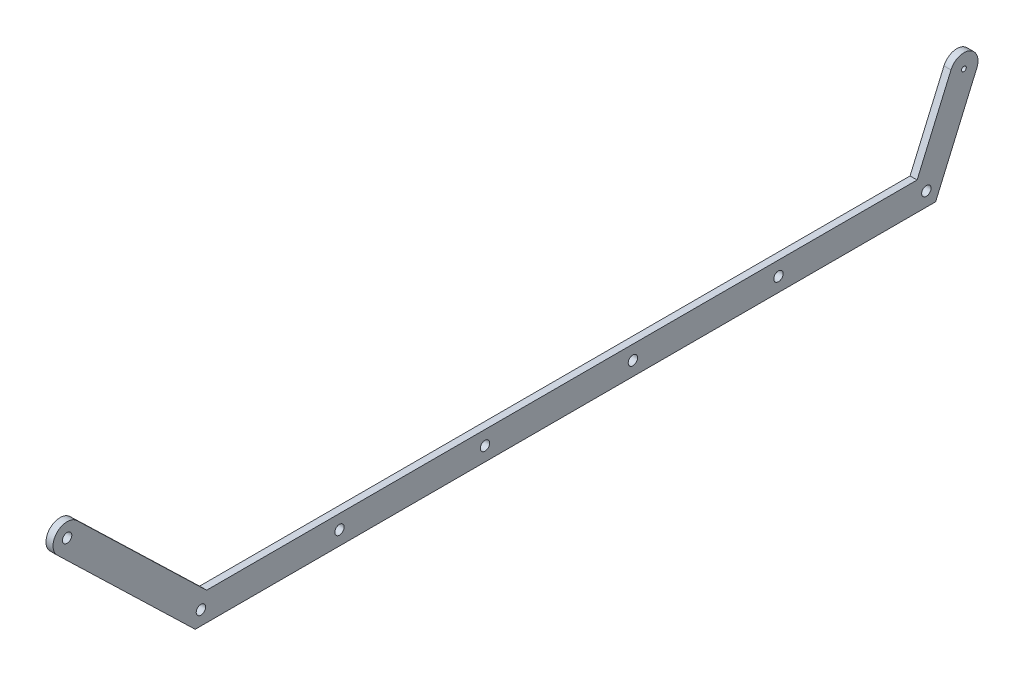
ISO-10303-21;
HEADER;
FILE_DESCRIPTION(('STEP AP214'),'2;1');
FILE_NAME('part.step','',(''),(''),'','','');
FILE_SCHEMA(('AUTOMOTIVE_DESIGN { 1 0 10303 214 1 1 1 1 }'));
ENDSEC;
DATA;
#1=APPLICATION_CONTEXT('core data for automotive mechanical design processes');
#2=APPLICATION_PROTOCOL_DEFINITION('international standard','automotive_design',2000,#1);
#3=PRODUCT_CONTEXT('',#1,'mechanical');
#4=PRODUCT('Part','Part','',(#3));
#5=PRODUCT_RELATED_PRODUCT_CATEGORY('part','',(#4));
#6=PRODUCT_DEFINITION_FORMATION('','',#4);
#7=PRODUCT_DEFINITION_CONTEXT('part definition',#1,'design');
#8=PRODUCT_DEFINITION('design','',#6,#7);
#9=PRODUCT_DEFINITION_SHAPE('','',#8);
#10=(LENGTH_UNIT() NAMED_UNIT(*) SI_UNIT(.MILLI.,.METRE.));
#11=(NAMED_UNIT(*) PLANE_ANGLE_UNIT() SI_UNIT($,.RADIAN.));
#12=(NAMED_UNIT(*) SI_UNIT($,.STERADIAN.) SOLID_ANGLE_UNIT());
#13=UNCERTAINTY_MEASURE_WITH_UNIT(LENGTH_MEASURE(1.E-05),#10,'distance_accuracy_value','');
#14=(GEOMETRIC_REPRESENTATION_CONTEXT(3) GLOBAL_UNCERTAINTY_ASSIGNED_CONTEXT((#13)) GLOBAL_UNIT_ASSIGNED_CONTEXT((#10,
#11,#12)) REPRESENTATION_CONTEXT('',''));
#15=CARTESIAN_POINT('',(0.,0.,0.));
#16=DIRECTION('',(0.,0.,1.));
#17=DIRECTION('',(1.,0.,0.));
#18=AXIS2_PLACEMENT_3D('',#15,#16,#17);
#19=CARTESIAN_POINT('',(3.,-18.,-382.));
#20=DIRECTION('',(-1.,0.,0.));
#21=DIRECTION('',(0.,0.,1.));
#22=AXIS2_PLACEMENT_3D('',#19,#20,#21);
#23=CYLINDRICAL_SURFACE('',#22,6.00000000000002);
#24=CARTESIAN_POINT('',(0.,-18.,-382.));
#25=DIRECTION('',(1.,0.,0.));
#26=DIRECTION('',(0.,0.,-1.));
#27=AXIS2_PLACEMENT_3D('',#24,#25,#26);
#28=CIRCLE('',#27,6.00000000000002);
#29=CARTESIAN_POINT('',(0.,-15.6185330958872,-376.492857784239));
#30=VERTEX_POINT('',#29);
#31=CARTESIAN_POINT('',(0.,-20.3814669041128,-387.507142215761));
#32=VERTEX_POINT('',#31);
#33=EDGE_CURVE('E150',#30,#32,#28,.F.);
#34=ORIENTED_EDGE('',*,*,#33,.F.);
#35=DIRECTION('',(-1.,0.,0.));
#36=VECTOR('',#35,1.);
#37=CARTESIAN_POINT('',(3.,-15.6185330958872,-376.492857784239));
#38=LINE('',#37,#36);
#39=CARTESIAN_POINT('',(3.,-15.6185330958872,-376.492857784239));
#40=VERTEX_POINT('',#39);
#41=EDGE_CURVE('E11',#40,#30,#38,.T.);
#42=ORIENTED_EDGE('',*,*,#41,.F.);
#43=CARTESIAN_POINT('',(3.,-18.,-382.));
#44=DIRECTION('',(1.,0.,0.));
#45=DIRECTION('',(0.,0.,-1.));
#46=AXIS2_PLACEMENT_3D('',#43,#44,#45);
#47=CIRCLE('',#46,6.00000000000002);
#48=CARTESIAN_POINT('',(3.,-20.3814669041128,-387.507142215761));
#49=VERTEX_POINT('',#48);
#50=EDGE_CURVE('E191',#40,#49,#47,.F.);
#51=ORIENTED_EDGE('',*,*,#50,.T.);
#52=DIRECTION('',(-1.,0.,0.));
#53=VECTOR('',#52,1.);
#54=CARTESIAN_POINT('',(3.,-20.3814669041128,-387.507142215761));
#55=LINE('',#54,#53);
#56=EDGE_CURVE('E84',#49,#32,#55,.T.);
#57=ORIENTED_EDGE('',*,*,#56,.T.);
#58=EDGE_LOOP('',(#34,#42,#51,#57));
#59=FACE_BOUND('',#58,.T.);
#60=ADVANCED_FACE('F33',(#59),#23,.T.);
#61=CARTESIAN_POINT('',(3.,-139.619763865118,-322.870703938085));
#62=DIRECTION('',(0.,-0.396911150685467,-0.917857035960143));
#63=DIRECTION('',(0.,0.917857035960143,-0.396911150685467));
#64=AXIS2_PLACEMENT_3D('',#61,#62,#63);
#65=PLANE('',#64);
#66=DIRECTION('',(0.,-0.917857035960143,0.396911150685467));
#67=VECTOR('',#66,1.);
#68=CARTESIAN_POINT('',(0.,-139.619763865118,-322.870703938085));
#69=LINE('',#68,#67);
#70=CARTESIAN_POINT('',(0.,-49.,-362.057628852731));
#71=VERTEX_POINT('',#70);
#72=EDGE_CURVE('E153',#30,#71,#69,.T.);
#73=ORIENTED_EDGE('',*,*,#72,.T.);
#74=DIRECTION('',(-1.,0.,0.));
#75=VECTOR('',#74,1.);
#76=CARTESIAN_POINT('',(3.,-49.,-362.057628852731));
#77=LINE('',#76,#75);
#78=CARTESIAN_POINT('',(3.,-49.,-362.057628852731));
#79=VERTEX_POINT('',#78);
#80=EDGE_CURVE('E41',#79,#71,#77,.T.);
#81=ORIENTED_EDGE('',*,*,#80,.F.);
#82=DIRECTION('',(0.,-0.917857035960143,0.396911150685467));
#83=VECTOR('',#82,1.);
#84=CARTESIAN_POINT('',(3.,-139.619763865118,-322.870703938085));
#85=LINE('',#84,#83);
#86=EDGE_CURVE('E220',#40,#79,#85,.T.);
#87=ORIENTED_EDGE('',*,*,#86,.F.);
#88=ORIENTED_EDGE('',*,*,#41,.T.);
#89=EDGE_LOOP('',(#73,#81,#87,#88));
#90=FACE_BOUND('',#89,.T.);
#91=ADVANCED_FACE('F224',(#90),#65,.F.);
#92=CARTESIAN_POINT('',(3.,-49.,0.));
#93=DIRECTION('',(0.,-1.,0.));
#94=DIRECTION('',(0.,0.,-1.));
#95=AXIS2_PLACEMENT_3D('',#92,#93,#94);
#96=PLANE('',#95);
#97=DIRECTION('',(0.,0.,1.));
#98=VECTOR('',#97,1.);
#99=CARTESIAN_POINT('',(0.,-49.,0.));
#100=LINE('',#99,#98);
#101=CARTESIAN_POINT('',(0.,-49.,-59.4227547701729));
#102=VERTEX_POINT('',#101);
#103=EDGE_CURVE('E155',#71,#102,#100,.T.);
#104=ORIENTED_EDGE('',*,*,#103,.T.);
#105=DIRECTION('',(-1.,0.,0.));
#106=VECTOR('',#105,1.);
#107=CARTESIAN_POINT('',(3.,-49.,-59.4227547701729));
#108=LINE('',#107,#106);
#109=CARTESIAN_POINT('',(3.,-49.,-59.4227547701729));
#110=VERTEX_POINT('',#109);
#111=EDGE_CURVE('E197',#110,#102,#108,.T.);
#112=ORIENTED_EDGE('',*,*,#111,.F.);
#113=DIRECTION('',(0.,0.,1.));
#114=VECTOR('',#113,1.);
#115=CARTESIAN_POINT('',(3.,-49.,0.));
#116=LINE('',#115,#114);
#117=EDGE_CURVE('E206',#79,#110,#116,.T.);
#118=ORIENTED_EDGE('',*,*,#117,.F.);
#119=ORIENTED_EDGE('',*,*,#80,.T.);
#120=EDGE_LOOP('',(#104,#112,#118,#119));
#121=FACE_BOUND('',#120,.T.);
#122=ADVANCED_FACE('F204',(#121),#96,.F.);
#123=CARTESIAN_POINT('',(3.,4.31771377183487,-4.16621504299856));
#124=DIRECTION('',(0.,-0.719618961972479,0.694369173833093));
#125=DIRECTION('',(0.,-0.694369173833093,-0.719618961972479));
#126=AXIS2_PLACEMENT_3D('',#123,#124,#125);
#127=PLANE('',#126);
#128=DIRECTION('',(0.,0.694369173833093,0.719618961972479));
#129=VECTOR('',#128,1.);
#130=CARTESIAN_POINT('',(0.,4.31771377183487,-4.16621504299856));
#131=LINE('',#130,#129);
#132=CARTESIAN_POINT('',(0.,4.31771377183486,-4.16621504299857));
#133=VERTEX_POINT('',#132);
#134=EDGE_CURVE('E157',#102,#133,#131,.T.);
#135=ORIENTED_EDGE('',*,*,#134,.T.);
#136=DIRECTION('',(-1.,0.,0.));
#137=VECTOR('',#136,1.);
#138=CARTESIAN_POINT('',(3.,4.31771377183486,-4.16621504299857));
#139=LINE('',#138,#137);
#140=CARTESIAN_POINT('',(3.,4.31771377183486,-4.16621504299857));
#141=VERTEX_POINT('',#140);
#142=EDGE_CURVE('E195',#141,#133,#139,.T.);
#143=ORIENTED_EDGE('',*,*,#142,.F.);
#144=DIRECTION('',(0.,0.694369173833093,0.719618961972479));
#145=VECTOR('',#144,1.);
#146=CARTESIAN_POINT('',(3.,4.31771377183487,-4.16621504299856));
#147=LINE('',#146,#145);
#148=EDGE_CURVE('E218',#110,#141,#147,.T.);
#149=ORIENTED_EDGE('',*,*,#148,.F.);
#150=ORIENTED_EDGE('',*,*,#111,.T.);
#151=EDGE_LOOP('',(#135,#143,#149,#150));
#152=FACE_BOUND('',#151,.T.);
#153=ADVANCED_FACE('F216',(#152),#127,.F.);
#154=CARTESIAN_POINT('',(3.,0.,0.));
#155=DIRECTION('',(-1.,0.,0.));
#156=DIRECTION('',(0.,0.,1.));
#157=AXIS2_PLACEMENT_3D('',#154,#155,#156);
#158=CYLINDRICAL_SURFACE('',#157,6.);
#159=CARTESIAN_POINT('',(0.,0.,0.));
#160=DIRECTION('',(1.,0.,0.));
#161=DIRECTION('',(0.,0.,-1.));
#162=AXIS2_PLACEMENT_3D('',#159,#160,#161);
#163=CIRCLE('',#162,6.);
#164=CARTESIAN_POINT('',(0.,-4.31771377183486,4.16621504299857));
#165=VERTEX_POINT('',#164);
#166=EDGE_CURVE('E160',#165,#133,#163,.F.);
#167=ORIENTED_EDGE('',*,*,#166,.F.);
#168=DIRECTION('',(-1.,0.,0.));
#169=VECTOR('',#168,1.);
#170=CARTESIAN_POINT('',(3.,-4.31771377183486,4.16621504299857));
#171=LINE('',#170,#169);
#172=CARTESIAN_POINT('',(3.,-4.31771377183486,4.16621504299857));
#173=VERTEX_POINT('',#172);
#174=EDGE_CURVE('E118',#173,#165,#171,.T.);
#175=ORIENTED_EDGE('',*,*,#174,.F.);
#176=CARTESIAN_POINT('',(3.,0.,0.));
#177=DIRECTION('',(1.,0.,0.));
#178=DIRECTION('',(0.,0.,-1.));
#179=AXIS2_PLACEMENT_3D('',#176,#177,#178);
#180=CIRCLE('',#179,6.);
#181=EDGE_CURVE('E111',#173,#141,#180,.F.);
#182=ORIENTED_EDGE('',*,*,#181,.T.);
#183=ORIENTED_EDGE('',*,*,#142,.T.);
#184=EDGE_LOOP('',(#167,#175,#182,#183));
#185=FACE_BOUND('',#184,.T.);
#186=ADVANCED_FACE('F234',(#185),#158,.T.);
#187=CARTESIAN_POINT('',(3.,-4.31714466740364,4.16680468094625));
#188=DIRECTION('',(0.,0.719524117945029,-0.694467453301757));
#189=DIRECTION('',(0.,0.694467453301757,0.719524117945029));
#190=AXIS2_PLACEMENT_3D('',#187,#188,#189);
#191=PLANE('',#190);
#192=DIRECTION('',(0.,-0.694467453301757,-0.719524117945029));
#193=VECTOR('',#192,1.);
#194=CARTESIAN_POINT('',(0.,-4.31714466740364,4.16680468094625));
#195=LINE('',#194,#193);
#196=CARTESIAN_POINT('',(0.,-61.,-54.5611908383348));
#197=VERTEX_POINT('',#196);
#198=EDGE_CURVE('E117',#165,#197,#195,.T.);
#199=ORIENTED_EDGE('',*,*,#198,.T.);
#200=DIRECTION('',(-1.,0.,0.));
#201=VECTOR('',#200,1.);
#202=CARTESIAN_POINT('',(3.,-61.,-54.5611908383348));
#203=LINE('',#202,#201);
#204=CARTESIAN_POINT('',(3.,-61.,-54.5611908383348));
#205=VERTEX_POINT('',#204);
#206=EDGE_CURVE('E114',#205,#197,#203,.T.);
#207=ORIENTED_EDGE('',*,*,#206,.F.);
#208=DIRECTION('',(0.,-0.694467453301757,-0.719524117945029));
#209=VECTOR('',#208,1.);
#210=CARTESIAN_POINT('',(3.,-4.31714466740364,4.16680468094625));
#211=LINE('',#210,#209);
#212=EDGE_CURVE('E104',#173,#205,#211,.T.);
#213=ORIENTED_EDGE('',*,*,#212,.F.);
#214=ORIENTED_EDGE('',*,*,#174,.T.);
#215=EDGE_LOOP('',(#199,#207,#213,#214));
#216=FACE_BOUND('',#215,.T.);
#217=ADVANCED_FACE('F115',(#216),#191,.F.);
#218=CARTESIAN_POINT('',(3.,-61.,0.));
#219=DIRECTION('',(0.,1.,0.));
#220=DIRECTION('',(0.,0.,1.));
#221=AXIS2_PLACEMENT_3D('',#218,#219,#220);
#222=PLANE('',#221);
#223=DIRECTION('',(0.,0.,-1.));
#224=VECTOR('',#223,1.);
#225=CARTESIAN_POINT('',(0.,-61.,0.));
#226=LINE('',#225,#224);
#227=CARTESIAN_POINT('',(0.,-61.,-369.942371147269));
#228=VERTEX_POINT('',#227);
#229=EDGE_CURVE('E77',#197,#228,#226,.T.);
#230=ORIENTED_EDGE('',*,*,#229,.T.);
#231=DIRECTION('',(-1.,0.,0.));
#232=VECTOR('',#231,1.);
#233=CARTESIAN_POINT('',(3.,-61.,-369.942371147269));
#234=LINE('',#233,#232);
#235=CARTESIAN_POINT('',(3.,-61.,-369.942371147269));
#236=VERTEX_POINT('',#235);
#237=EDGE_CURVE('E119',#236,#228,#234,.T.);
#238=ORIENTED_EDGE('',*,*,#237,.F.);
#239=DIRECTION('',(0.,0.,-1.));
#240=VECTOR('',#239,1.);
#241=CARTESIAN_POINT('',(3.,-61.,0.));
#242=LINE('',#241,#240);
#243=EDGE_CURVE('E109',#205,#236,#242,.T.);
#244=ORIENTED_EDGE('',*,*,#243,.F.);
#245=ORIENTED_EDGE('',*,*,#206,.T.);
#246=EDGE_LOOP('',(#230,#238,#244,#245));
#247=FACE_BOUND('',#246,.T.);
#248=ADVANCED_FACE('F121',(#247),#222,.F.);
#249=CARTESIAN_POINT('',(3.,-55.,-57.));
#250=DIRECTION('',(-1.,0.,0.));
#251=DIRECTION('',(0.,0.,1.));
#252=AXIS2_PLACEMENT_3D('',#249,#250,#251);
#253=CYLINDRICAL_SURFACE('',#252,2.);
#254=CARTESIAN_POINT('',(3.,-55.,-57.));
#255=DIRECTION('',(1.,0.,0.));
#256=DIRECTION('',(0.,0.,-1.));
#257=AXIS2_PLACEMENT_3D('',#254,#255,#256);
#258=CIRCLE('',#257,2.);
#259=CARTESIAN_POINT('',(3.,-55.,-59.));
#260=VERTEX_POINT('',#259);
#261=EDGE_CURVE('E144',#260,#260,#258,.T.);
#262=ORIENTED_EDGE('',*,*,#261,.T.);
#263=EDGE_LOOP('',(#262));
#264=FACE_BOUND('',#263,.T.);
#265=CARTESIAN_POINT('',(0.,-55.,-57.));
#266=DIRECTION('',(1.,0.,0.));
#267=DIRECTION('',(0.,0.,-1.));
#268=AXIS2_PLACEMENT_3D('',#265,#266,#267);
#269=CIRCLE('',#268,2.);
#270=CARTESIAN_POINT('',(0.,-55.,-59.));
#271=VERTEX_POINT('',#270);
#272=EDGE_CURVE('E185',#271,#271,#269,.T.);
#273=ORIENTED_EDGE('',*,*,#272,.F.);
#274=EDGE_LOOP('',(#273));
#275=FACE_BOUND('',#274,.T.);
#276=ADVANCED_FACE('F242',(#264,#275),#253,.F.);
#277=CARTESIAN_POINT('',(3.,-55.,-116.));
#278=DIRECTION('',(-1.,0.,0.));
#279=DIRECTION('',(0.,0.,1.));
#280=AXIS2_PLACEMENT_3D('',#277,#278,#279);
#281=CYLINDRICAL_SURFACE('',#280,2.);
#282=CARTESIAN_POINT('',(3.,-55.,-116.));
#283=DIRECTION('',(1.,0.,0.));
#284=DIRECTION('',(0.,0.,-1.));
#285=AXIS2_PLACEMENT_3D('',#282,#283,#284);
#286=CIRCLE('',#285,2.);
#287=CARTESIAN_POINT('',(3.,-55.,-118.));
#288=VERTEX_POINT('',#287);
#289=EDGE_CURVE('E141',#288,#288,#286,.T.);
#290=ORIENTED_EDGE('',*,*,#289,.T.);
#291=EDGE_LOOP('',(#290));
#292=FACE_BOUND('',#291,.T.);
#293=CARTESIAN_POINT('',(0.,-55.,-116.));
#294=DIRECTION('',(1.,0.,0.));
#295=DIRECTION('',(0.,0.,-1.));
#296=AXIS2_PLACEMENT_3D('',#293,#294,#295);
#297=CIRCLE('',#296,2.);
#298=CARTESIAN_POINT('',(0.,-55.,-118.));
#299=VERTEX_POINT('',#298);
#300=EDGE_CURVE('E182',#299,#299,#297,.T.);
#301=ORIENTED_EDGE('',*,*,#300,.F.);
#302=EDGE_LOOP('',(#301));
#303=FACE_BOUND('',#302,.T.);
#304=ADVANCED_FACE('F267',(#292,#303),#281,.F.);
#305=CARTESIAN_POINT('',(3.,-55.,-178.));
#306=DIRECTION('',(-1.,0.,0.));
#307=DIRECTION('',(0.,0.,1.));
#308=AXIS2_PLACEMENT_3D('',#305,#306,#307);
#309=CYLINDRICAL_SURFACE('',#308,2.);
#310=CARTESIAN_POINT('',(3.,-55.,-178.));
#311=DIRECTION('',(1.,0.,0.));
#312=DIRECTION('',(0.,0.,-1.));
#313=AXIS2_PLACEMENT_3D('',#310,#311,#312);
#314=CIRCLE('',#313,2.);
#315=CARTESIAN_POINT('',(3.,-55.,-180.));
#316=VERTEX_POINT('',#315);
#317=EDGE_CURVE('E138',#316,#316,#314,.T.);
#318=ORIENTED_EDGE('',*,*,#317,.T.);
#319=EDGE_LOOP('',(#318));
#320=FACE_BOUND('',#319,.T.);
#321=CARTESIAN_POINT('',(0.,-55.,-178.));
#322=DIRECTION('',(1.,0.,0.));
#323=DIRECTION('',(0.,0.,-1.));
#324=AXIS2_PLACEMENT_3D('',#321,#322,#323);
#325=CIRCLE('',#324,2.);
#326=CARTESIAN_POINT('',(0.,-55.,-180.));
#327=VERTEX_POINT('',#326);
#328=EDGE_CURVE('E179',#327,#327,#325,.T.);
#329=ORIENTED_EDGE('',*,*,#328,.F.);
#330=EDGE_LOOP('',(#329));
#331=FACE_BOUND('',#330,.T.);
#332=ADVANCED_FACE('F263',(#320,#331),#309,.F.);
#333=CARTESIAN_POINT('',(3.,-55.,-241.));
#334=DIRECTION('',(-1.,0.,0.));
#335=DIRECTION('',(0.,0.,1.));
#336=AXIS2_PLACEMENT_3D('',#333,#334,#335);
#337=CYLINDRICAL_SURFACE('',#336,2.);
#338=CARTESIAN_POINT('',(3.,-55.,-241.));
#339=DIRECTION('',(1.,0.,0.));
#340=DIRECTION('',(0.,0.,-1.));
#341=AXIS2_PLACEMENT_3D('',#338,#339,#340);
#342=CIRCLE('',#341,2.);
#343=CARTESIAN_POINT('',(3.,-55.,-243.));
#344=VERTEX_POINT('',#343);
#345=EDGE_CURVE('E135',#344,#344,#342,.T.);
#346=ORIENTED_EDGE('',*,*,#345,.T.);
#347=EDGE_LOOP('',(#346));
#348=FACE_BOUND('',#347,.T.);
#349=CARTESIAN_POINT('',(0.,-55.,-241.));
#350=DIRECTION('',(1.,0.,0.));
#351=DIRECTION('',(0.,0.,-1.));
#352=AXIS2_PLACEMENT_3D('',#349,#350,#351);
#353=CIRCLE('',#352,2.);
#354=CARTESIAN_POINT('',(0.,-55.,-243.));
#355=VERTEX_POINT('',#354);
#356=EDGE_CURVE('E176',#355,#355,#353,.T.);
#357=ORIENTED_EDGE('',*,*,#356,.F.);
#358=EDGE_LOOP('',(#357));
#359=FACE_BOUND('',#358,.T.);
#360=ADVANCED_FACE('F259',(#348,#359),#337,.F.);
#361=CARTESIAN_POINT('',(3.,-55.,-303.));
#362=DIRECTION('',(-1.,0.,0.));
#363=DIRECTION('',(0.,0.,1.));
#364=AXIS2_PLACEMENT_3D('',#361,#362,#363);
#365=CYLINDRICAL_SURFACE('',#364,2.);
#366=CARTESIAN_POINT('',(3.,-55.,-303.));
#367=DIRECTION('',(1.,0.,0.));
#368=DIRECTION('',(0.,0.,-1.));
#369=AXIS2_PLACEMENT_3D('',#366,#367,#368);
#370=CIRCLE('',#369,2.);
#371=CARTESIAN_POINT('',(3.,-55.,-305.));
#372=VERTEX_POINT('',#371);
#373=EDGE_CURVE('E132',#372,#372,#370,.T.);
#374=ORIENTED_EDGE('',*,*,#373,.T.);
#375=EDGE_LOOP('',(#374));
#376=FACE_BOUND('',#375,.T.);
#377=CARTESIAN_POINT('',(0.,-55.,-303.));
#378=DIRECTION('',(1.,0.,0.));
#379=DIRECTION('',(0.,0.,-1.));
#380=AXIS2_PLACEMENT_3D('',#377,#378,#379);
#381=CIRCLE('',#380,2.);
#382=CARTESIAN_POINT('',(0.,-55.,-305.));
#383=VERTEX_POINT('',#382);
#384=EDGE_CURVE('E173',#383,#383,#381,.T.);
#385=ORIENTED_EDGE('',*,*,#384,.F.);
#386=EDGE_LOOP('',(#385));
#387=FACE_BOUND('',#386,.T.);
#388=ADVANCED_FACE('F255',(#376,#387),#365,.F.);
#389=CARTESIAN_POINT('',(3.,-55.,-366.));
#390=DIRECTION('',(-1.,0.,0.));
#391=DIRECTION('',(0.,0.,1.));
#392=AXIS2_PLACEMENT_3D('',#389,#390,#391);
#393=CYLINDRICAL_SURFACE('',#392,2.);
#394=CARTESIAN_POINT('',(3.,-55.,-366.));
#395=DIRECTION('',(1.,0.,0.));
#396=DIRECTION('',(0.,0.,-1.));
#397=AXIS2_PLACEMENT_3D('',#394,#395,#396);
#398=CIRCLE('',#397,2.);
#399=CARTESIAN_POINT('',(3.,-55.,-368.));
#400=VERTEX_POINT('',#399);
#401=EDGE_CURVE('E129',#400,#400,#398,.T.);
#402=ORIENTED_EDGE('',*,*,#401,.T.);
#403=EDGE_LOOP('',(#402));
#404=FACE_BOUND('',#403,.T.);
#405=CARTESIAN_POINT('',(0.,-55.,-366.));
#406=DIRECTION('',(1.,0.,0.));
#407=DIRECTION('',(0.,0.,-1.));
#408=AXIS2_PLACEMENT_3D('',#405,#406,#407);
#409=CIRCLE('',#408,2.);
#410=CARTESIAN_POINT('',(0.,-55.,-368.));
#411=VERTEX_POINT('',#410);
#412=EDGE_CURVE('E170',#411,#411,#409,.T.);
#413=ORIENTED_EDGE('',*,*,#412,.F.);
#414=EDGE_LOOP('',(#413));
#415=FACE_BOUND('',#414,.T.);
#416=ADVANCED_FACE('F251',(#404,#415),#393,.F.);
#417=CARTESIAN_POINT('',(3.,-18.,-382.));
#418=DIRECTION('',(-1.,0.,0.));
#419=DIRECTION('',(0.,0.,1.));
#420=AXIS2_PLACEMENT_3D('',#417,#418,#419);
#421=CYLINDRICAL_SURFACE('',#420,0.999999999999998);
#422=CARTESIAN_POINT('',(3.,-18.,-382.));
#423=DIRECTION('',(1.,0.,0.));
#424=DIRECTION('',(0.,0.,-1.));
#425=AXIS2_PLACEMENT_3D('',#422,#423,#424);
#426=CIRCLE('',#425,0.999999999999998);
#427=CARTESIAN_POINT('',(3.,-18.,-383.));
#428=VERTEX_POINT('',#427);
#429=EDGE_CURVE('E123',#428,#428,#426,.T.);
#430=ORIENTED_EDGE('',*,*,#429,.T.);
#431=EDGE_LOOP('',(#430));
#432=FACE_BOUND('',#431,.T.);
#433=CARTESIAN_POINT('',(0.,-18.,-382.));
#434=DIRECTION('',(1.,0.,0.));
#435=DIRECTION('',(0.,0.,-1.));
#436=AXIS2_PLACEMENT_3D('',#433,#434,#435);
#437=CIRCLE('',#436,0.999999999999998);
#438=CARTESIAN_POINT('',(0.,-18.,-383.));
#439=VERTEX_POINT('',#438);
#440=EDGE_CURVE('E167',#439,#439,#437,.T.);
#441=ORIENTED_EDGE('',*,*,#440,.F.);
#442=EDGE_LOOP('',(#441));
#443=FACE_BOUND('',#442,.T.);
#444=ADVANCED_FACE('F247',(#432,#443),#421,.F.);
#445=CARTESIAN_POINT('',(3.,-144.382697673344,-333.884988369607));
#446=DIRECTION('',(0.,0.396911150685468,0.917857035960142));
#447=DIRECTION('',(0.,-0.917857035960142,0.396911150685468));
#448=AXIS2_PLACEMENT_3D('',#445,#446,#447);
#449=PLANE('',#448);
#450=DIRECTION('',(0.,0.917857035960142,-0.396911150685468));
#451=VECTOR('',#450,1.);
#452=CARTESIAN_POINT('',(0.,-144.382697673344,-333.884988369607));
#453=LINE('',#452,#451);
#454=EDGE_CURVE('E165',#228,#32,#453,.T.);
#455=ORIENTED_EDGE('',*,*,#454,.T.);
#456=ORIENTED_EDGE('',*,*,#56,.F.);
#457=DIRECTION('',(0.,0.917857035960142,-0.396911150685468));
#458=VECTOR('',#457,1.);
#459=CARTESIAN_POINT('',(3.,-144.382697673344,-333.884988369607));
#460=LINE('',#459,#458);
#461=EDGE_CURVE('E49',#236,#49,#460,.T.);
#462=ORIENTED_EDGE('',*,*,#461,.F.);
#463=ORIENTED_EDGE('',*,*,#237,.T.);
#464=EDGE_LOOP('',(#455,#456,#462,#463));
#465=FACE_BOUND('',#464,.T.);
#466=ADVANCED_FACE('F243',(#465),#449,.F.);
#467=CARTESIAN_POINT('',(3.,0.,0.));
#468=DIRECTION('',(-1.,0.,0.));
#469=DIRECTION('',(0.,0.,1.));
#470=AXIS2_PLACEMENT_3D('',#467,#468,#469);
#471=CYLINDRICAL_SURFACE('',#470,2.);
#472=CARTESIAN_POINT('',(3.,0.,0.));
#473=DIRECTION('',(1.,0.,0.));
#474=DIRECTION('',(0.,0.,-1.));
#475=AXIS2_PLACEMENT_3D('',#472,#473,#474);
#476=CIRCLE('',#475,2.);
#477=CARTESIAN_POINT('',(3.,0.,-2.));
#478=VERTEX_POINT('',#477);
#479=EDGE_CURVE('E147',#478,#478,#476,.T.);
#480=ORIENTED_EDGE('',*,*,#479,.T.);
#481=EDGE_LOOP('',(#480));
#482=FACE_BOUND('',#481,.T.);
#483=CARTESIAN_POINT('',(0.,0.,0.));
#484=DIRECTION('',(1.,0.,0.));
#485=DIRECTION('',(0.,0.,-1.));
#486=AXIS2_PLACEMENT_3D('',#483,#484,#485);
#487=CIRCLE('',#486,2.);
#488=CARTESIAN_POINT('',(0.,0.,-2.));
#489=VERTEX_POINT('',#488);
#490=EDGE_CURVE('E188',#489,#489,#487,.T.);
#491=ORIENTED_EDGE('',*,*,#490,.F.);
#492=EDGE_LOOP('',(#491));
#493=FACE_BOUND('',#492,.T.);
#494=ADVANCED_FACE('F246',(#482,#493),#471,.F.);
#495=CARTESIAN_POINT('',(3.,0.,0.));
#496=DIRECTION('',(1.,0.,0.));
#497=DIRECTION('',(0.,0.,-1.));
#498=AXIS2_PLACEMENT_3D('',#495,#496,#497);
#499=PLANE('',#498);
#500=ORIENTED_EDGE('',*,*,#50,.F.);
#501=ORIENTED_EDGE('',*,*,#86,.T.);
#502=ORIENTED_EDGE('',*,*,#117,.T.);
#503=ORIENTED_EDGE('',*,*,#148,.T.);
#504=ORIENTED_EDGE('',*,*,#181,.F.);
#505=ORIENTED_EDGE('',*,*,#212,.T.);
#506=ORIENTED_EDGE('',*,*,#243,.T.);
#507=ORIENTED_EDGE('',*,*,#461,.T.);
#508=EDGE_LOOP('',(#500,#501,#502,#503,#504,#505,#506,#507));
#509=FACE_BOUND('',#508,.T.);
#510=ORIENTED_EDGE('',*,*,#429,.F.);
#511=EDGE_LOOP('',(#510));
#512=FACE_BOUND('',#511,.T.);
#513=ORIENTED_EDGE('',*,*,#401,.F.);
#514=EDGE_LOOP('',(#513));
#515=FACE_BOUND('',#514,.T.);
#516=ORIENTED_EDGE('',*,*,#373,.F.);
#517=EDGE_LOOP('',(#516));
#518=FACE_BOUND('',#517,.T.);
#519=ORIENTED_EDGE('',*,*,#345,.F.);
#520=EDGE_LOOP('',(#519));
#521=FACE_BOUND('',#520,.T.);
#522=ORIENTED_EDGE('',*,*,#317,.F.);
#523=EDGE_LOOP('',(#522));
#524=FACE_BOUND('',#523,.T.);
#525=ORIENTED_EDGE('',*,*,#289,.F.);
#526=EDGE_LOOP('',(#525));
#527=FACE_BOUND('',#526,.T.);
#528=ORIENTED_EDGE('',*,*,#261,.F.);
#529=EDGE_LOOP('',(#528));
#530=FACE_BOUND('',#529,.T.);
#531=ORIENTED_EDGE('',*,*,#479,.F.);
#532=EDGE_LOOP('',(#531));
#533=FACE_BOUND('',#532,.T.);
#534=ADVANCED_FACE('F106',(#509,#512,#515,#518,#521,#524,#527,#530,#533),#499,.T.);
#535=CARTESIAN_POINT('',(0.,0.,0.));
#536=DIRECTION('',(1.,0.,0.));
#537=DIRECTION('',(0.,0.,-1.));
#538=AXIS2_PLACEMENT_3D('',#535,#536,#537);
#539=PLANE('',#538);
#540=ORIENTED_EDGE('',*,*,#33,.T.);
#541=ORIENTED_EDGE('',*,*,#454,.F.);
#542=ORIENTED_EDGE('',*,*,#229,.F.);
#543=ORIENTED_EDGE('',*,*,#198,.F.);
#544=ORIENTED_EDGE('',*,*,#166,.T.);
#545=ORIENTED_EDGE('',*,*,#134,.F.);
#546=ORIENTED_EDGE('',*,*,#103,.F.);
#547=ORIENTED_EDGE('',*,*,#72,.F.);
#548=EDGE_LOOP('',(#540,#541,#542,#543,#544,#545,#546,#547));
#549=FACE_BOUND('',#548,.T.);
#550=ORIENTED_EDGE('',*,*,#440,.T.);
#551=EDGE_LOOP('',(#550));
#552=FACE_BOUND('',#551,.T.);
#553=ORIENTED_EDGE('',*,*,#412,.T.);
#554=EDGE_LOOP('',(#553));
#555=FACE_BOUND('',#554,.T.);
#556=ORIENTED_EDGE('',*,*,#384,.T.);
#557=EDGE_LOOP('',(#556));
#558=FACE_BOUND('',#557,.T.);
#559=ORIENTED_EDGE('',*,*,#356,.T.);
#560=EDGE_LOOP('',(#559));
#561=FACE_BOUND('',#560,.T.);
#562=ORIENTED_EDGE('',*,*,#328,.T.);
#563=EDGE_LOOP('',(#562));
#564=FACE_BOUND('',#563,.T.);
#565=ORIENTED_EDGE('',*,*,#300,.T.);
#566=EDGE_LOOP('',(#565));
#567=FACE_BOUND('',#566,.T.);
#568=ORIENTED_EDGE('',*,*,#272,.T.);
#569=EDGE_LOOP('',(#568));
#570=FACE_BOUND('',#569,.T.);
#571=ORIENTED_EDGE('',*,*,#490,.T.);
#572=EDGE_LOOP('',(#571));
#573=FACE_BOUND('',#572,.T.);
#574=ADVANCED_FACE('F211',(#549,#552,#555,#558,#561,#564,#567,#570,#573),#539,.F.);
#575=CLOSED_SHELL('',(#60,#91,#122,#153,#186,#217,#248,#276,#304,#332,#360,#388,#416,#444,#466,
#494,#534,#574));
#576=MANIFOLD_SOLID_BREP('B2',#575);
#577=ADVANCED_BREP_SHAPE_REPRESENTATION('',(#18,#576),#14);
#578=SHAPE_DEFINITION_REPRESENTATION(#9,#577);
ENDSEC;
END-ISO-10303-21;
